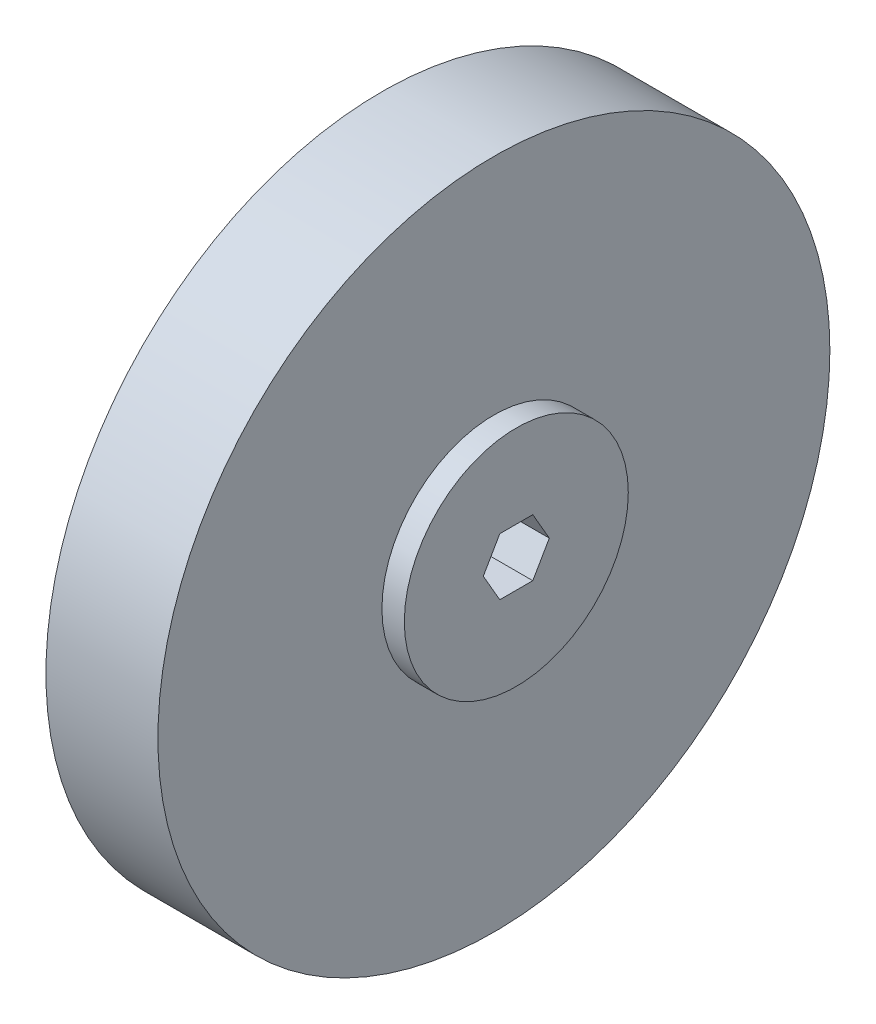
ISO-10303-21;
HEADER;
FILE_DESCRIPTION(('STEP AP214'),'2;1');
FILE_NAME('part.step','',(''),(''),'','','');
FILE_SCHEMA(('AUTOMOTIVE_DESIGN { 1 0 10303 214 1 1 1 1 }'));
ENDSEC;
DATA;
#1=APPLICATION_CONTEXT('core data for automotive mechanical design processes');
#2=APPLICATION_PROTOCOL_DEFINITION('international standard','automotive_design',2000,#1);
#3=PRODUCT_CONTEXT('',#1,'mechanical');
#4=PRODUCT('Part','Part','',(#3));
#5=PRODUCT_RELATED_PRODUCT_CATEGORY('part','',(#4));
#6=PRODUCT_DEFINITION_FORMATION('','',#4);
#7=PRODUCT_DEFINITION_CONTEXT('part definition',#1,'design');
#8=PRODUCT_DEFINITION('design','',#6,#7);
#9=PRODUCT_DEFINITION_SHAPE('','',#8);
#10=(LENGTH_UNIT() NAMED_UNIT(*) SI_UNIT(.MILLI.,.METRE.));
#11=(NAMED_UNIT(*) PLANE_ANGLE_UNIT() SI_UNIT($,.RADIAN.));
#12=(NAMED_UNIT(*) SI_UNIT($,.STERADIAN.) SOLID_ANGLE_UNIT());
#13=UNCERTAINTY_MEASURE_WITH_UNIT(LENGTH_MEASURE(1.E-05),#10,'distance_accuracy_value','');
#14=(GEOMETRIC_REPRESENTATION_CONTEXT(3) GLOBAL_UNCERTAINTY_ASSIGNED_CONTEXT((#13)) GLOBAL_UNIT_ASSIGNED_CONTEXT((#10,
#11,#12)) REPRESENTATION_CONTEXT('',''));
#15=CARTESIAN_POINT('',(0.,0.,0.));
#16=DIRECTION('',(0.,0.,1.));
#17=DIRECTION('',(1.,0.,0.));
#18=AXIS2_PLACEMENT_3D('',#15,#16,#17);
#19=CARTESIAN_POINT('',(25.,0.,0.));
#20=DIRECTION('',(-1.,0.,0.));
#21=DIRECTION('',(0.,0.,1.));
#22=AXIS2_PLACEMENT_3D('',#19,#20,#21);
#23=CYLINDRICAL_SURFACE('',#22,75.);
#24=CARTESIAN_POINT('',(25.,0.,0.));
#25=DIRECTION('',(1.,0.,0.));
#26=DIRECTION('',(0.,0.,-1.));
#27=AXIS2_PLACEMENT_3D('',#24,#25,#26);
#28=CIRCLE('',#27,75.);
#29=CARTESIAN_POINT('',(25.,0.,-75.));
#30=VERTEX_POINT('',#29);
#31=EDGE_CURVE('E133',#30,#30,#28,.T.);
#32=ORIENTED_EDGE('',*,*,#31,.F.);
#33=EDGE_LOOP('',(#32));
#34=FACE_BOUND('',#33,.T.);
#35=CARTESIAN_POINT('',(0.,0.,0.));
#36=DIRECTION('',(1.,0.,0.));
#37=DIRECTION('',(0.,0.,-1.));
#38=AXIS2_PLACEMENT_3D('',#35,#36,#37);
#39=CIRCLE('',#38,75.);
#40=CARTESIAN_POINT('',(0.,0.,-75.));
#41=VERTEX_POINT('',#40);
#42=EDGE_CURVE('E130',#41,#41,#39,.T.);
#43=ORIENTED_EDGE('',*,*,#42,.T.);
#44=EDGE_LOOP('',(#43));
#45=FACE_BOUND('',#44,.T.);
#46=ADVANCED_FACE('F33',(#34,#45),#23,.T.);
#47=CARTESIAN_POINT('',(25.,0.,0.));
#48=DIRECTION('',(1.,0.,0.));
#49=DIRECTION('',(0.,0.,-1.));
#50=AXIS2_PLACEMENT_3D('',#47,#48,#49);
#51=PLANE('',#50);
#52=CARTESIAN_POINT('',(25.,0.,0.));
#53=DIRECTION('',(1.,0.,0.));
#54=DIRECTION('',(0.,0.,-1.));
#55=AXIS2_PLACEMENT_3D('',#52,#53,#54);
#56=CIRCLE('',#55,25.);
#57=CARTESIAN_POINT('',(25.,0.,-25.));
#58=VERTEX_POINT('',#57);
#59=EDGE_CURVE('E126',#58,#58,#56,.T.);
#60=ORIENTED_EDGE('',*,*,#59,.F.);
#61=EDGE_LOOP('',(#60));
#62=FACE_BOUND('',#61,.T.);
#63=ORIENTED_EDGE('',*,*,#31,.T.);
#64=EDGE_LOOP('',(#63));
#65=FACE_BOUND('',#64,.T.);
#66=ADVANCED_FACE('F173',(#62,#65),#51,.T.);
#67=CARTESIAN_POINT('',(0.,0.,0.));
#68=DIRECTION('',(1.,0.,0.));
#69=DIRECTION('',(0.,0.,-1.));
#70=AXIS2_PLACEMENT_3D('',#67,#68,#69);
#71=PLANE('',#70);
#72=CARTESIAN_POINT('',(0.,0.,0.));
#73=DIRECTION('',(1.,0.,0.));
#74=DIRECTION('',(0.,0.,-1.));
#75=AXIS2_PLACEMENT_3D('',#72,#73,#74);
#76=CIRCLE('',#75,25.);
#77=CARTESIAN_POINT('',(0.,0.,-25.));
#78=VERTEX_POINT('',#77);
#79=EDGE_CURVE('E136',#78,#78,#76,.F.);
#80=ORIENTED_EDGE('',*,*,#79,.F.);
#81=EDGE_LOOP('',(#80));
#82=FACE_BOUND('',#81,.T.);
#83=ORIENTED_EDGE('',*,*,#42,.F.);
#84=EDGE_LOOP('',(#83));
#85=FACE_BOUND('',#84,.T.);
#86=ADVANCED_FACE('F178',(#82,#85),#71,.F.);
#87=CARTESIAN_POINT('',(30.,0.,0.));
#88=DIRECTION('',(-1.,0.,0.));
#89=DIRECTION('',(0.,0.,1.));
#90=AXIS2_PLACEMENT_3D('',#87,#88,#89);
#91=CYLINDRICAL_SURFACE('',#90,25.);
#92=CARTESIAN_POINT('',(30.,0.,0.));
#93=DIRECTION('',(1.,0.,0.));
#94=DIRECTION('',(0.,0.,-1.));
#95=AXIS2_PLACEMENT_3D('',#92,#93,#94);
#96=CIRCLE('',#95,25.);
#97=CARTESIAN_POINT('',(30.,0.,-25.));
#98=VERTEX_POINT('',#97);
#99=EDGE_CURVE('E127',#98,#98,#96,.T.);
#100=ORIENTED_EDGE('',*,*,#99,.F.);
#101=EDGE_LOOP('',(#100));
#102=FACE_BOUND('',#101,.T.);
#103=ORIENTED_EDGE('',*,*,#59,.T.);
#104=EDGE_LOOP('',(#103));
#105=FACE_BOUND('',#104,.T.);
#106=ADVANCED_FACE('F186',(#102,#105),#91,.T.);
#107=CARTESIAN_POINT('',(30.,0.,0.));
#108=DIRECTION('',(1.,0.,0.));
#109=DIRECTION('',(0.,0.,-1.));
#110=AXIS2_PLACEMENT_3D('',#107,#108,#109);
#111=PLANE('',#110);
#112=DIRECTION('',(0.,0.866025403784439,-0.5));
#113=VECTOR('',#112,1.);
#114=CARTESIAN_POINT('',(30.,-6.38000000000001,-3.68349471742981));
#115=LINE('',#114,#113);
#116=CARTESIAN_POINT('',(30.,-6.38000000000001,-3.68349471742981));
#117=VERTEX_POINT('',#116);
#118=CARTESIAN_POINT('',(30.,0.,-7.36698943485963));
#119=VERTEX_POINT('',#118);
#120=EDGE_CURVE('E47',#117,#119,#115,.T.);
#121=ORIENTED_EDGE('',*,*,#120,.F.);
#122=DIRECTION('',(0.,0.,-1.));
#123=VECTOR('',#122,1.);
#124=CARTESIAN_POINT('',(30.,-6.38000000000001,3.68349471742981));
#125=LINE('',#124,#123);
#126=CARTESIAN_POINT('',(30.,-6.38000000000001,3.68349471742981));
#127=VERTEX_POINT('',#126);
#128=EDGE_CURVE('E112',#127,#117,#125,.T.);
#129=ORIENTED_EDGE('',*,*,#128,.F.);
#130=DIRECTION('',(0.,-0.866025403784439,-0.5));
#131=VECTOR('',#130,1.);
#132=CARTESIAN_POINT('',(30.,0.,7.36698943485963));
#133=LINE('',#132,#131);
#134=CARTESIAN_POINT('',(30.,0.,7.36698943485963));
#135=VERTEX_POINT('',#134);
#136=EDGE_CURVE('E106',#135,#127,#133,.T.);
#137=ORIENTED_EDGE('',*,*,#136,.F.);
#138=DIRECTION('',(0.,-0.866025403784439,0.5));
#139=VECTOR('',#138,1.);
#140=CARTESIAN_POINT('',(30.,6.38000000000001,3.68349471742982));
#141=LINE('',#140,#139);
#142=CARTESIAN_POINT('',(30.,6.38000000000001,3.68349471742982));
#143=VERTEX_POINT('',#142);
#144=EDGE_CURVE('E104',#143,#135,#141,.T.);
#145=ORIENTED_EDGE('',*,*,#144,.F.);
#146=DIRECTION('',(0.,0.,1.));
#147=VECTOR('',#146,1.);
#148=CARTESIAN_POINT('',(30.,6.38000000000001,-3.68349471742981));
#149=LINE('',#148,#147);
#150=CARTESIAN_POINT('',(30.,6.38000000000001,-3.68349471742981));
#151=VERTEX_POINT('',#150);
#152=EDGE_CURVE('E87',#151,#143,#149,.T.);
#153=ORIENTED_EDGE('',*,*,#152,.F.);
#154=DIRECTION('',(0.,0.866025403784439,0.5));
#155=VECTOR('',#154,1.);
#156=CARTESIAN_POINT('',(30.,0.,-7.36698943485963));
#157=LINE('',#156,#155);
#158=EDGE_CURVE('E96',#119,#151,#157,.T.);
#159=ORIENTED_EDGE('',*,*,#158,.F.);
#160=EDGE_LOOP('',(#121,#129,#137,#145,#153,#159));
#161=FACE_BOUND('',#160,.T.);
#162=ORIENTED_EDGE('',*,*,#99,.T.);
#163=EDGE_LOOP('',(#162));
#164=FACE_BOUND('',#163,.T.);
#165=ADVANCED_FACE('F100',(#161,#164),#111,.T.);
#166=CARTESIAN_POINT('',(-5.,0.,0.));
#167=DIRECTION('',(1.,0.,0.));
#168=DIRECTION('',(0.,0.,-1.));
#169=AXIS2_PLACEMENT_3D('',#166,#167,#168);
#170=CYLINDRICAL_SURFACE('',#169,25.);
#171=CARTESIAN_POINT('',(-5.,0.,0.));
#172=DIRECTION('',(-1.,0.,0.));
#173=DIRECTION('',(0.,0.,1.));
#174=AXIS2_PLACEMENT_3D('',#171,#172,#173);
#175=CIRCLE('',#174,25.);
#176=CARTESIAN_POINT('',(-5.,0.,25.));
#177=VERTEX_POINT('',#176);
#178=EDGE_CURVE('E117',#177,#177,#175,.T.);
#179=ORIENTED_EDGE('',*,*,#178,.F.);
#180=EDGE_LOOP('',(#179));
#181=FACE_BOUND('',#180,.T.);
#182=ORIENTED_EDGE('',*,*,#79,.T.);
#183=EDGE_LOOP('',(#182));
#184=FACE_BOUND('',#183,.T.);
#185=ADVANCED_FACE('F197',(#181,#184),#170,.T.);
#186=CARTESIAN_POINT('',(-5.,0.,0.));
#187=DIRECTION('',(-1.,0.,0.));
#188=DIRECTION('',(0.,0.,1.));
#189=AXIS2_PLACEMENT_3D('',#186,#187,#188);
#190=PLANE('',#189);
#191=DIRECTION('',(0.,-0.866025403784439,0.5));
#192=VECTOR('',#191,1.);
#193=CARTESIAN_POINT('',(-5.,-3.19,-5.52524207614472));
#194=LINE('',#193,#192);
#195=CARTESIAN_POINT('',(-5.,0.,-7.36698943485963));
#196=VERTEX_POINT('',#195);
#197=CARTESIAN_POINT('',(-5.,-6.38000000000001,-3.68349471742981));
#198=VERTEX_POINT('',#197);
#199=EDGE_CURVE('E11',#196,#198,#194,.T.);
#200=ORIENTED_EDGE('',*,*,#199,.F.);
#201=DIRECTION('',(0.,-0.866025403784439,-0.5));
#202=VECTOR('',#201,1.);
#203=CARTESIAN_POINT('',(-5.,3.19,-5.52524207614472));
#204=LINE('',#203,#202);
#205=CARTESIAN_POINT('',(-5.,6.38000000000001,-3.68349471742981));
#206=VERTEX_POINT('',#205);
#207=EDGE_CURVE('E141',#206,#196,#204,.T.);
#208=ORIENTED_EDGE('',*,*,#207,.F.);
#209=DIRECTION('',(0.,0.,-1.));
#210=VECTOR('',#209,1.);
#211=CARTESIAN_POINT('',(-5.,6.38000000000001,0.));
#212=LINE('',#211,#210);
#213=CARTESIAN_POINT('',(-5.,6.38000000000001,3.68349471742982));
#214=VERTEX_POINT('',#213);
#215=EDGE_CURVE('E90',#214,#206,#212,.T.);
#216=ORIENTED_EDGE('',*,*,#215,.F.);
#217=DIRECTION('',(0.,0.866025403784439,-0.5));
#218=VECTOR('',#217,1.);
#219=CARTESIAN_POINT('',(-5.,3.19,5.52524207614472));
#220=LINE('',#219,#218);
#221=CARTESIAN_POINT('',(-5.,0.,7.36698943485963));
#222=VERTEX_POINT('',#221);
#223=EDGE_CURVE('E144',#222,#214,#220,.T.);
#224=ORIENTED_EDGE('',*,*,#223,.F.);
#225=DIRECTION('',(0.,0.866025403784439,0.5));
#226=VECTOR('',#225,1.);
#227=CARTESIAN_POINT('',(-5.,-3.19,5.52524207614472));
#228=LINE('',#227,#226);
#229=CARTESIAN_POINT('',(-5.,-6.38000000000001,3.68349471742981));
#230=VERTEX_POINT('',#229);
#231=EDGE_CURVE('E146',#230,#222,#228,.T.);
#232=ORIENTED_EDGE('',*,*,#231,.F.);
#233=DIRECTION('',(0.,0.,1.));
#234=VECTOR('',#233,1.);
#235=CARTESIAN_POINT('',(-5.,-6.38000000000001,0.));
#236=LINE('',#235,#234);
#237=EDGE_CURVE('E40',#198,#230,#236,.T.);
#238=ORIENTED_EDGE('',*,*,#237,.F.);
#239=EDGE_LOOP('',(#200,#208,#216,#224,#232,#238));
#240=FACE_BOUND('',#239,.T.);
#241=ORIENTED_EDGE('',*,*,#178,.T.);
#242=EDGE_LOOP('',(#241));
#243=FACE_BOUND('',#242,.T.);
#244=ADVANCED_FACE('F160',(#240,#243),#190,.T.);
#245=CARTESIAN_POINT('',(-10.,-6.38000000000001,-3.68349471742981));
#246=DIRECTION('',(0.,-0.5,-0.866025403784439));
#247=DIRECTION('',(0.,0.866025403784439,-0.5));
#248=AXIS2_PLACEMENT_3D('',#245,#246,#247);
#249=PLANE('',#248);
#250=ORIENTED_EDGE('',*,*,#199,.T.);
#251=DIRECTION('',(1.,0.,0.));
#252=VECTOR('',#251,1.);
#253=CARTESIAN_POINT('',(-10.,-6.38000000000001,-3.68349471742981));
#254=LINE('',#253,#252);
#255=EDGE_CURVE('E115',#198,#117,#254,.T.);
#256=ORIENTED_EDGE('',*,*,#255,.T.);
#257=ORIENTED_EDGE('',*,*,#120,.T.);
#258=DIRECTION('',(1.,0.,0.));
#259=VECTOR('',#258,1.);
#260=CARTESIAN_POINT('',(-10.,0.,-7.36698943485963));
#261=LINE('',#260,#259);
#262=EDGE_CURVE('E93',#196,#119,#261,.T.);
#263=ORIENTED_EDGE('',*,*,#262,.F.);
#264=EDGE_LOOP('',(#250,#256,#257,#263));
#265=FACE_BOUND('',#264,.T.);
#266=ADVANCED_FACE('F203',(#265),#249,.F.);
#267=CARTESIAN_POINT('',(-10.,-6.38000000000001,3.68349471742981));
#268=DIRECTION('',(0.,-1.,0.));
#269=DIRECTION('',(0.,0.,-1.));
#270=AXIS2_PLACEMENT_3D('',#267,#268,#269);
#271=PLANE('',#270);
#272=ORIENTED_EDGE('',*,*,#237,.T.);
#273=DIRECTION('',(1.,0.,0.));
#274=VECTOR('',#273,1.);
#275=CARTESIAN_POINT('',(-10.,-6.38000000000001,3.68349471742981));
#276=LINE('',#275,#274);
#277=EDGE_CURVE('E118',#230,#127,#276,.T.);
#278=ORIENTED_EDGE('',*,*,#277,.T.);
#279=ORIENTED_EDGE('',*,*,#128,.T.);
#280=ORIENTED_EDGE('',*,*,#255,.F.);
#281=EDGE_LOOP('',(#272,#278,#279,#280));
#282=FACE_BOUND('',#281,.T.);
#283=ADVANCED_FACE('F151',(#282),#271,.F.);
#284=CARTESIAN_POINT('',(-10.,0.,7.36698943485963));
#285=DIRECTION('',(0.,-0.5,0.866025403784439));
#286=DIRECTION('',(0.,-0.866025403784439,-0.5));
#287=AXIS2_PLACEMENT_3D('',#284,#285,#286);
#288=PLANE('',#287);
#289=ORIENTED_EDGE('',*,*,#231,.T.);
#290=DIRECTION('',(1.,0.,0.));
#291=VECTOR('',#290,1.);
#292=CARTESIAN_POINT('',(-10.,0.,7.36698943485963));
#293=LINE('',#292,#291);
#294=EDGE_CURVE('E120',#222,#135,#293,.T.);
#295=ORIENTED_EDGE('',*,*,#294,.T.);
#296=ORIENTED_EDGE('',*,*,#136,.T.);
#297=ORIENTED_EDGE('',*,*,#277,.F.);
#298=EDGE_LOOP('',(#289,#295,#296,#297));
#299=FACE_BOUND('',#298,.T.);
#300=ADVANCED_FACE('F156',(#299),#288,.F.);
#301=CARTESIAN_POINT('',(-10.,6.38000000000001,3.68349471742982));
#302=DIRECTION('',(0.,0.5,0.866025403784439));
#303=DIRECTION('',(0.,-0.866025403784439,0.5));
#304=AXIS2_PLACEMENT_3D('',#301,#302,#303);
#305=PLANE('',#304);
#306=ORIENTED_EDGE('',*,*,#223,.T.);
#307=DIRECTION('',(1.,0.,0.));
#308=VECTOR('',#307,1.);
#309=CARTESIAN_POINT('',(-10.,6.38000000000001,3.68349471742982));
#310=LINE('',#309,#308);
#311=EDGE_CURVE('E92',#214,#143,#310,.T.);
#312=ORIENTED_EDGE('',*,*,#311,.T.);
#313=ORIENTED_EDGE('',*,*,#144,.T.);
#314=ORIENTED_EDGE('',*,*,#294,.F.);
#315=EDGE_LOOP('',(#306,#312,#313,#314));
#316=FACE_BOUND('',#315,.T.);
#317=ADVANCED_FACE('F163',(#316),#305,.F.);
#318=CARTESIAN_POINT('',(-10.,6.38000000000001,-3.68349471742981));
#319=DIRECTION('',(0.,1.,0.));
#320=DIRECTION('',(0.,0.,1.));
#321=AXIS2_PLACEMENT_3D('',#318,#319,#320);
#322=PLANE('',#321);
#323=ORIENTED_EDGE('',*,*,#215,.T.);
#324=DIRECTION('',(1.,0.,0.));
#325=VECTOR('',#324,1.);
#326=CARTESIAN_POINT('',(-10.,6.38000000000001,-3.68349471742981));
#327=LINE('',#326,#325);
#328=EDGE_CURVE('E55',#206,#151,#327,.T.);
#329=ORIENTED_EDGE('',*,*,#328,.T.);
#330=ORIENTED_EDGE('',*,*,#152,.T.);
#331=ORIENTED_EDGE('',*,*,#311,.F.);
#332=EDGE_LOOP('',(#323,#329,#330,#331));
#333=FACE_BOUND('',#332,.T.);
#334=ADVANCED_FACE('F84',(#333),#322,.F.);
#335=CARTESIAN_POINT('',(-10.,0.,-7.36698943485963));
#336=DIRECTION('',(0.,0.5,-0.866025403784439));
#337=DIRECTION('',(0.,0.866025403784439,0.5));
#338=AXIS2_PLACEMENT_3D('',#335,#336,#337);
#339=PLANE('',#338);
#340=ORIENTED_EDGE('',*,*,#207,.T.);
#341=ORIENTED_EDGE('',*,*,#262,.T.);
#342=ORIENTED_EDGE('',*,*,#158,.T.);
#343=ORIENTED_EDGE('',*,*,#328,.F.);
#344=EDGE_LOOP('',(#340,#341,#342,#343));
#345=FACE_BOUND('',#344,.T.);
#346=ADVANCED_FACE('F97',(#345),#339,.F.);
#347=CLOSED_SHELL('',(#46,#66,#86,#106,#165,#185,#244,#266,#283,#300,#317,#334,#346));
#348=MANIFOLD_SOLID_BREP('B2',#347);
#349=ADVANCED_BREP_SHAPE_REPRESENTATION('',(#18,#348),#14);
#350=SHAPE_DEFINITION_REPRESENTATION(#9,#349);
ENDSEC;
END-ISO-10303-21;
